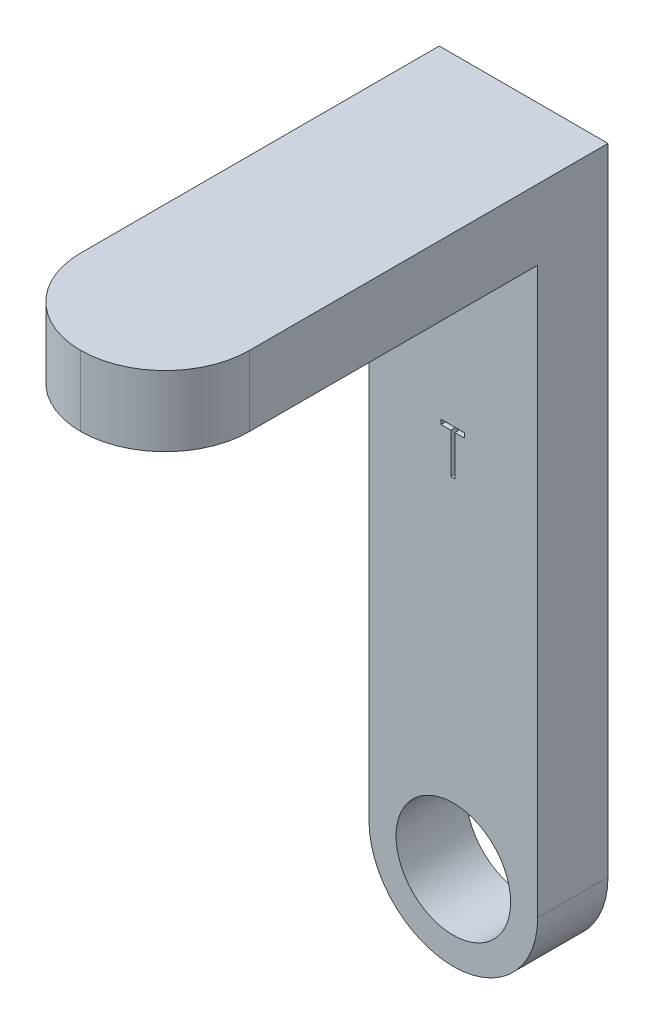
ISO-10303-21;
HEADER;
FILE_DESCRIPTION(('STEP AP214'),'2;1');
FILE_NAME('part.step','',(''),(''),'','','');
FILE_SCHEMA(('AUTOMOTIVE_DESIGN { 1 0 10303 214 1 1 1 1 }'));
ENDSEC;
DATA;
#1=APPLICATION_CONTEXT('core data for automotive mechanical design processes');
#2=APPLICATION_PROTOCOL_DEFINITION('international standard','automotive_design',2000,#1);
#3=PRODUCT_CONTEXT('',#1,'mechanical');
#4=PRODUCT('Part','Part','',(#3));
#5=PRODUCT_RELATED_PRODUCT_CATEGORY('part','',(#4));
#6=PRODUCT_DEFINITION_FORMATION('','',#4);
#7=PRODUCT_DEFINITION_CONTEXT('part definition',#1,'design');
#8=PRODUCT_DEFINITION('design','',#6,#7);
#9=PRODUCT_DEFINITION_SHAPE('','',#8);
#10=(LENGTH_UNIT() NAMED_UNIT(*) SI_UNIT(.MILLI.,.METRE.));
#11=(NAMED_UNIT(*) PLANE_ANGLE_UNIT() SI_UNIT($,.RADIAN.));
#12=(NAMED_UNIT(*) SI_UNIT($,.STERADIAN.) SOLID_ANGLE_UNIT());
#13=UNCERTAINTY_MEASURE_WITH_UNIT(LENGTH_MEASURE(1.E-05),#10,'distance_accuracy_value','');
#14=(GEOMETRIC_REPRESENTATION_CONTEXT(3) GLOBAL_UNCERTAINTY_ASSIGNED_CONTEXT((#13)) GLOBAL_UNIT_ASSIGNED_CONTEXT((#10,
#11,#12)) REPRESENTATION_CONTEXT('',''));
#15=CARTESIAN_POINT('',(0.,0.,0.));
#16=DIRECTION('',(0.,0.,1.));
#17=DIRECTION('',(1.,0.,0.));
#18=AXIS2_PLACEMENT_3D('',#15,#16,#17);
#19=CARTESIAN_POINT('',(0.,0.,5.));
#20=DIRECTION('',(0.,0.,1.));
#21=DIRECTION('',(1.,0.,0.));
#22=AXIS2_PLACEMENT_3D('',#19,#20,#21);
#23=PLANE('',#22);
#24=DIRECTION('',(1.,0.,0.));
#25=VECTOR('',#24,1.);
#26=CARTESIAN_POINT('',(-6.,40.2,5.));
#27=LINE('',#26,#25);
#28=CARTESIAN_POINT('',(-6.,40.2,5.));
#29=VERTEX_POINT('',#28);
#30=CARTESIAN_POINT('',(6.,40.2,5.));
#31=VERTEX_POINT('',#30);
#32=EDGE_CURVE('E188',#29,#31,#27,.T.);
#33=ORIENTED_EDGE('',*,*,#32,.F.);
#34=DIRECTION('',(0.,-1.,0.));
#35=VECTOR('',#34,1.);
#36=CARTESIAN_POINT('',(-6.,0.,5.));
#37=LINE('',#36,#35);
#38=CARTESIAN_POINT('',(-6.,0.,5.));
#39=VERTEX_POINT('',#38);
#40=EDGE_CURVE('E211',#29,#39,#37,.T.);
#41=ORIENTED_EDGE('',*,*,#40,.T.);
#42=CARTESIAN_POINT('',(0.,0.,5.));
#43=DIRECTION('',(0.,0.,1.));
#44=DIRECTION('',(1.,0.,0.));
#45=AXIS2_PLACEMENT_3D('',#42,#43,#44);
#46=CIRCLE('',#45,6.);
#47=CARTESIAN_POINT('',(6.,0.,5.));
#48=VERTEX_POINT('',#47);
#49=EDGE_CURVE('E257',#39,#48,#46,.T.);
#50=ORIENTED_EDGE('',*,*,#49,.T.);
#51=DIRECTION('',(0.,1.,0.));
#52=VECTOR('',#51,1.);
#53=CARTESIAN_POINT('',(6.,0.,5.));
#54=LINE('',#53,#52);
#55=EDGE_CURVE('E205',#48,#31,#54,.T.);
#56=ORIENTED_EDGE('',*,*,#55,.T.);
#57=EDGE_LOOP('',(#33,#41,#50,#56));
#58=FACE_BOUND('',#57,.T.);
#59=CARTESIAN_POINT('',(0.,0.,5.));
#60=DIRECTION('',(0.,0.,1.));
#61=DIRECTION('',(1.,0.,0.));
#62=AXIS2_PLACEMENT_3D('',#59,#60,#61);
#63=CIRCLE('',#62,4.075);
#64=CARTESIAN_POINT('',(4.075,0.,5.));
#65=VERTEX_POINT('',#64);
#66=EDGE_CURVE('E239',#65,#65,#63,.T.);
#67=ORIENTED_EDGE('',*,*,#66,.F.);
#68=EDGE_LOOP('',(#67));
#69=FACE_BOUND('',#68,.T.);
#70=DIRECTION('',(0.,1.,0.));
#71=VECTOR('',#70,1.);
#72=CARTESIAN_POINT('',(-0.180940787218244,24.0946969776369,5.));
#73=LINE('',#72,#71);
#74=CARTESIAN_POINT('',(-0.180940787218244,24.0946969776369,5.));
#75=VERTEX_POINT('',#74);
#76=CARTESIAN_POINT('',(-0.180940787218244,26.9440559519959,5.));
#77=VERTEX_POINT('',#76);
#78=EDGE_CURVE('E177',#75,#77,#73,.T.);
#79=ORIENTED_EDGE('',*,*,#78,.T.);
#80=DIRECTION('',(-1.,0.,0.));
#81=VECTOR('',#80,1.);
#82=CARTESIAN_POINT('',(-0.180940787218244,26.9440559519959,5.));
#83=LINE('',#82,#81);
#84=CARTESIAN_POINT('',(-0.872927966705424,26.9440559519959,5.));
#85=VERTEX_POINT('',#84);
#86=EDGE_CURVE('E56',#77,#85,#83,.T.);
#87=ORIENTED_EDGE('',*,*,#86,.T.);
#88=DIRECTION('',(0.,1.,0.));
#89=VECTOR('',#88,1.);
#90=CARTESIAN_POINT('',(-0.872927966705424,26.9440559519959,5.));
#91=LINE('',#90,#89);
#92=CARTESIAN_POINT('',(-0.872927966705424,27.2696969776369,5.));
#93=VERTEX_POINT('',#92);
#94=EDGE_CURVE('E181',#85,#93,#91,.T.);
#95=ORIENTED_EDGE('',*,*,#94,.T.);
#96=DIRECTION('',(1.,0.,0.));
#97=VECTOR('',#96,1.);
#98=CARTESIAN_POINT('',(-0.872927966705424,27.2696969776369,5.));
#99=LINE('',#98,#97);
#100=CARTESIAN_POINT('',(0.795982289704833,27.2696969776369,5.));
#101=VERTEX_POINT('',#100);
#102=EDGE_CURVE('E555',#93,#101,#99,.T.);
#103=ORIENTED_EDGE('',*,*,#102,.T.);
#104=DIRECTION('',(0.,-1.,0.));
#105=VECTOR('',#104,1.);
#106=CARTESIAN_POINT('',(0.795982289704833,27.2696969776369,5.));
#107=LINE('',#106,#105);
#108=CARTESIAN_POINT('',(0.795982289704833,26.9440559519959,5.));
#109=VERTEX_POINT('',#108);
#110=EDGE_CURVE('E557',#101,#109,#107,.T.);
#111=ORIENTED_EDGE('',*,*,#110,.T.);
#112=DIRECTION('',(-1.,0.,0.));
#113=VECTOR('',#112,1.);
#114=CARTESIAN_POINT('',(0.795982289704833,26.9440559519959,5.));
#115=LINE('',#114,#113);
#116=CARTESIAN_POINT('',(0.103995110217653,26.9440559519959,5.));
#117=VERTEX_POINT('',#116);
#118=EDGE_CURVE('E533',#109,#117,#115,.T.);
#119=ORIENTED_EDGE('',*,*,#118,.T.);
#120=DIRECTION('',(0.,-1.,0.));
#121=VECTOR('',#120,1.);
#122=CARTESIAN_POINT('',(0.103995110217653,26.9440559519959,5.));
#123=LINE('',#122,#121);
#124=CARTESIAN_POINT('',(0.103995110217653,24.0946969776369,5.));
#125=VERTEX_POINT('',#124);
#126=EDGE_CURVE('E528',#117,#125,#123,.T.);
#127=ORIENTED_EDGE('',*,*,#126,.T.);
#128=DIRECTION('',(-1.,0.,0.));
#129=VECTOR('',#128,1.);
#130=CARTESIAN_POINT('',(0.103995110217653,24.0946969776369,5.));
#131=LINE('',#130,#129);
#132=EDGE_CURVE('E522',#125,#75,#131,.T.);
#133=ORIENTED_EDGE('',*,*,#132,.T.);
#134=EDGE_LOOP('',(#79,#87,#95,#103,#111,#119,#127,#133));
#135=FACE_BOUND('',#134,.T.);
#136=ADVANCED_FACE('F39',(#58,#69,#135),#23,.T.);
#137=CARTESIAN_POINT('',(-2.83725219182222,2.925,5.));
#138=DIRECTION('',(0.,-1.,0.));
#139=DIRECTION('',(0.,0.,-1.));
#140=AXIS2_PLACEMENT_3D('',#137,#138,#139);
#141=PLANE('',#140);
#142=DIRECTION('',(0.,0.,-1.));
#143=VECTOR('',#142,1.);
#144=CARTESIAN_POINT('',(2.83725219182222,2.925,5.));
#145=LINE('',#144,#143);
#146=CARTESIAN_POINT('',(2.83725219182222,2.925,2.));
#147=VERTEX_POINT('',#146);
#148=CARTESIAN_POINT('',(2.83725219182222,2.925,0.));
#149=VERTEX_POINT('',#148);
#150=EDGE_CURVE('E253',#147,#149,#145,.T.);
#151=ORIENTED_EDGE('',*,*,#150,.F.);
#152=DIRECTION('',(-1.,0.,0.));
#153=VECTOR('',#152,1.);
#154=CARTESIAN_POINT('',(-2.83725219182222,2.925,2.));
#155=LINE('',#154,#153);
#156=CARTESIAN_POINT('',(-2.83725219182222,2.925,2.));
#157=VERTEX_POINT('',#156);
#158=EDGE_CURVE('E261',#147,#157,#155,.T.);
#159=ORIENTED_EDGE('',*,*,#158,.T.);
#160=DIRECTION('',(0.,0.,-1.));
#161=VECTOR('',#160,1.);
#162=CARTESIAN_POINT('',(-2.83725219182222,2.925,5.));
#163=LINE('',#162,#161);
#164=CARTESIAN_POINT('',(-2.83725219182222,2.925,0.));
#165=VERTEX_POINT('',#164);
#166=EDGE_CURVE('E243',#157,#165,#163,.T.);
#167=ORIENTED_EDGE('',*,*,#166,.T.);
#168=DIRECTION('',(-1.,0.,0.));
#169=VECTOR('',#168,1.);
#170=CARTESIAN_POINT('',(-2.83725219182222,2.925,0.));
#171=LINE('',#170,#169);
#172=EDGE_CURVE('E244',#149,#165,#171,.T.);
#173=ORIENTED_EDGE('',*,*,#172,.F.);
#174=EDGE_LOOP('',(#151,#159,#167,#173));
#175=FACE_BOUND('',#174,.T.);
#176=ADVANCED_FACE('F322',(#175),#141,.T.);
#177=CARTESIAN_POINT('',(0.,0.,0.));
#178=DIRECTION('',(0.,0.,1.));
#179=DIRECTION('',(1.,0.,0.));
#180=AXIS2_PLACEMENT_3D('',#177,#178,#179);
#181=PLANE('',#180);
#182=CARTESIAN_POINT('',(0.,0.,0.));
#183=DIRECTION('',(0.,0.,1.));
#184=DIRECTION('',(1.,0.,0.));
#185=AXIS2_PLACEMENT_3D('',#182,#183,#184);
#186=CIRCLE('',#185,6.);
#187=CARTESIAN_POINT('',(-6.,0.,0.));
#188=VERTEX_POINT('',#187);
#189=CARTESIAN_POINT('',(6.,0.,0.));
#190=VERTEX_POINT('',#189);
#191=EDGE_CURVE('E256',#188,#190,#186,.T.);
#192=ORIENTED_EDGE('',*,*,#191,.F.);
#193=DIRECTION('',(0.,-1.,0.));
#194=VECTOR('',#193,1.);
#195=CARTESIAN_POINT('',(-6.,0.,0.));
#196=LINE('',#195,#194);
#197=CARTESIAN_POINT('',(-6.,45.2,0.));
#198=VERTEX_POINT('',#197);
#199=EDGE_CURVE('E215',#198,#188,#196,.T.);
#200=ORIENTED_EDGE('',*,*,#199,.F.);
#201=DIRECTION('',(-1.,0.,0.));
#202=VECTOR('',#201,1.);
#203=CARTESIAN_POINT('',(6.,45.2,0.));
#204=LINE('',#203,#202);
#205=CARTESIAN_POINT('',(6.,45.2,0.));
#206=VERTEX_POINT('',#205);
#207=EDGE_CURVE('E210',#206,#198,#204,.T.);
#208=ORIENTED_EDGE('',*,*,#207,.F.);
#209=DIRECTION('',(0.,1.,0.));
#210=VECTOR('',#209,1.);
#211=CARTESIAN_POINT('',(6.,0.,0.));
#212=LINE('',#211,#210);
#213=EDGE_CURVE('E206',#190,#206,#212,.T.);
#214=ORIENTED_EDGE('',*,*,#213,.F.);
#215=EDGE_LOOP('',(#192,#200,#208,#214));
#216=FACE_BOUND('',#215,.T.);
#217=CARTESIAN_POINT('',(0.,0.,0.));
#218=DIRECTION('',(0.,0.,1.));
#219=DIRECTION('',(1.,0.,0.));
#220=AXIS2_PLACEMENT_3D('',#217,#218,#219);
#221=CIRCLE('',#220,4.075);
#222=EDGE_CURVE('E228',#165,#149,#221,.T.);
#223=ORIENTED_EDGE('',*,*,#222,.T.);
#224=ORIENTED_EDGE('',*,*,#172,.T.);
#225=EDGE_LOOP('',(#223,#224));
#226=FACE_BOUND('',#225,.T.);
#227=ADVANCED_FACE('F309',(#216,#226),#181,.F.);
#228=CARTESIAN_POINT('',(0.,0.,5.));
#229=DIRECTION('',(0.,0.,-1.));
#230=DIRECTION('',(-1.,0.,0.));
#231=AXIS2_PLACEMENT_3D('',#228,#229,#230);
#232=CYLINDRICAL_SURFACE('',#231,6.);
#233=ORIENTED_EDGE('',*,*,#49,.F.);
#234=DIRECTION('',(0.,0.,1.));
#235=VECTOR('',#234,1.);
#236=CARTESIAN_POINT('',(-6.,0.,0.));
#237=LINE('',#236,#235);
#238=EDGE_CURVE('E224',#188,#39,#237,.T.);
#239=ORIENTED_EDGE('',*,*,#238,.F.);
#240=ORIENTED_EDGE('',*,*,#191,.T.);
#241=DIRECTION('',(0.,0.,1.));
#242=VECTOR('',#241,1.);
#243=CARTESIAN_POINT('',(6.,0.,0.));
#244=LINE('',#243,#242);
#245=EDGE_CURVE('E218',#190,#48,#244,.T.);
#246=ORIENTED_EDGE('',*,*,#245,.T.);
#247=EDGE_LOOP('',(#233,#239,#240,#246));
#248=FACE_BOUND('',#247,.T.);
#249=ADVANCED_FACE('F312',(#248),#232,.T.);
#250=CARTESIAN_POINT('',(0.,0.,5.));
#251=DIRECTION('',(0.,0.,-1.));
#252=DIRECTION('',(-1.,0.,0.));
#253=AXIS2_PLACEMENT_3D('',#250,#251,#252);
#254=CYLINDRICAL_SURFACE('',#253,4.075);
#255=CARTESIAN_POINT('',(0.,0.,2.));
#256=DIRECTION('',(0.,0.,1.));
#257=DIRECTION('',(1.,0.,0.));
#258=AXIS2_PLACEMENT_3D('',#255,#256,#257);
#259=CIRCLE('',#258,4.075);
#260=EDGE_CURVE('E202',#147,#157,#259,.T.);
#261=ORIENTED_EDGE('',*,*,#260,.F.);
#262=ORIENTED_EDGE('',*,*,#150,.T.);
#263=ORIENTED_EDGE('',*,*,#222,.F.);
#264=ORIENTED_EDGE('',*,*,#166,.F.);
#265=EDGE_LOOP('',(#261,#262,#263,#264));
#266=FACE_BOUND('',#265,.T.);
#267=ORIENTED_EDGE('',*,*,#66,.T.);
#268=EDGE_LOOP('',(#267));
#269=FACE_BOUND('',#268,.T.);
#270=ADVANCED_FACE('F314',(#266,#269),#254,.F.);
#271=CARTESIAN_POINT('',(-6.,0.,0.));
#272=DIRECTION('',(-1.,0.,0.));
#273=DIRECTION('',(0.,0.,1.));
#274=AXIS2_PLACEMENT_3D('',#271,#272,#273);
#275=PLANE('',#274);
#276=DIRECTION('',(0.,0.,-1.));
#277=VECTOR('',#276,1.);
#278=CARTESIAN_POINT('',(-6.,40.2,31.5));
#279=LINE('',#278,#277);
#280=CARTESIAN_POINT('',(-6.,40.2,25.5));
#281=VERTEX_POINT('',#280);
#282=EDGE_CURVE('E199',#281,#29,#279,.T.);
#283=ORIENTED_EDGE('',*,*,#282,.F.);
#284=DIRECTION('',(0.,-1.,0.));
#285=VECTOR('',#284,1.);
#286=CARTESIAN_POINT('',(-6.,0.,25.5));
#287=LINE('',#286,#285);
#288=CARTESIAN_POINT('',(-6.,45.2,25.5));
#289=VERTEX_POINT('',#288);
#290=EDGE_CURVE('E274',#281,#289,#287,.F.);
#291=ORIENTED_EDGE('',*,*,#290,.T.);
#292=DIRECTION('',(0.,0.,1.));
#293=VECTOR('',#292,1.);
#294=CARTESIAN_POINT('',(-6.,45.2,0.));
#295=LINE('',#294,#293);
#296=EDGE_CURVE('E229',#198,#289,#295,.T.);
#297=ORIENTED_EDGE('',*,*,#296,.F.);
#298=ORIENTED_EDGE('',*,*,#199,.T.);
#299=ORIENTED_EDGE('',*,*,#238,.T.);
#300=ORIENTED_EDGE('',*,*,#40,.F.);
#301=EDGE_LOOP('',(#283,#291,#297,#298,#299,#300));
#302=FACE_BOUND('',#301,.T.);
#303=ADVANCED_FACE('F297',(#302),#275,.T.);
#304=CARTESIAN_POINT('',(6.,45.2,0.));
#305=DIRECTION('',(0.,1.,0.));
#306=DIRECTION('',(0.,0.,1.));
#307=AXIS2_PLACEMENT_3D('',#304,#305,#306);
#308=PLANE('',#307);
#309=ORIENTED_EDGE('',*,*,#296,.T.);
#310=CARTESIAN_POINT('',(0.,45.2,25.5));
#311=DIRECTION('',(0.,1.,0.));
#312=DIRECTION('',(0.,0.,1.));
#313=AXIS2_PLACEMENT_3D('',#310,#311,#312);
#314=CIRCLE('',#313,6.);
#315=CARTESIAN_POINT('',(0.,45.2,31.5));
#316=VERTEX_POINT('',#315);
#317=EDGE_CURVE('E49',#289,#316,#314,.T.);
#318=ORIENTED_EDGE('',*,*,#317,.T.);
#319=CARTESIAN_POINT('',(0.,45.2,25.5));
#320=DIRECTION('',(0.,1.,0.));
#321=DIRECTION('',(0.,0.,1.));
#322=AXIS2_PLACEMENT_3D('',#319,#320,#321);
#323=CIRCLE('',#322,6.);
#324=CARTESIAN_POINT('',(6.,45.2,25.5));
#325=VERTEX_POINT('',#324);
#326=EDGE_CURVE('E64',#316,#325,#323,.T.);
#327=ORIENTED_EDGE('',*,*,#326,.T.);
#328=DIRECTION('',(0.,0.,1.));
#329=VECTOR('',#328,1.);
#330=CARTESIAN_POINT('',(6.,45.2,0.));
#331=LINE('',#330,#329);
#332=EDGE_CURVE('E233',#206,#325,#331,.T.);
#333=ORIENTED_EDGE('',*,*,#332,.F.);
#334=ORIENTED_EDGE('',*,*,#207,.T.);
#335=EDGE_LOOP('',(#309,#318,#327,#333,#334));
#336=FACE_BOUND('',#335,.T.);
#337=ADVANCED_FACE('F281',(#336),#308,.T.);
#338=CARTESIAN_POINT('',(6.,0.,0.));
#339=DIRECTION('',(1.,0.,0.));
#340=DIRECTION('',(0.,0.,-1.));
#341=AXIS2_PLACEMENT_3D('',#338,#339,#340);
#342=PLANE('',#341);
#343=ORIENTED_EDGE('',*,*,#332,.T.);
#344=DIRECTION('',(0.,1.,0.));
#345=VECTOR('',#344,1.);
#346=CARTESIAN_POINT('',(6.,0.,25.5));
#347=LINE('',#346,#345);
#348=CARTESIAN_POINT('',(6.,40.2,25.5));
#349=VERTEX_POINT('',#348);
#350=EDGE_CURVE('E11',#325,#349,#347,.F.);
#351=ORIENTED_EDGE('',*,*,#350,.T.);
#352=DIRECTION('',(0.,0.,-1.));
#353=VECTOR('',#352,1.);
#354=CARTESIAN_POINT('',(6.,40.2,31.5));
#355=LINE('',#354,#353);
#356=EDGE_CURVE('E196',#349,#31,#355,.T.);
#357=ORIENTED_EDGE('',*,*,#356,.T.);
#358=ORIENTED_EDGE('',*,*,#55,.F.);
#359=ORIENTED_EDGE('',*,*,#245,.F.);
#360=ORIENTED_EDGE('',*,*,#213,.T.);
#361=EDGE_LOOP('',(#343,#351,#357,#358,#359,#360));
#362=FACE_BOUND('',#361,.T.);
#363=ADVANCED_FACE('F303',(#362),#342,.T.);
#364=CARTESIAN_POINT('',(0.,0.,2.));
#365=DIRECTION('',(0.,0.,1.));
#366=DIRECTION('',(1.,0.,0.));
#367=AXIS2_PLACEMENT_3D('',#364,#365,#366);
#368=PLANE('',#367);
#369=ORIENTED_EDGE('',*,*,#260,.T.);
#370=ORIENTED_EDGE('',*,*,#158,.F.);
#371=EDGE_LOOP('',(#369,#370));
#372=FACE_BOUND('',#371,.T.);
#373=ADVANCED_FACE('F334',(#372),#368,.T.);
#374=CARTESIAN_POINT('',(-6.,40.2,31.5));
#375=DIRECTION('',(0.,1.,0.));
#376=DIRECTION('',(0.,0.,1.));
#377=AXIS2_PLACEMENT_3D('',#374,#375,#376);
#378=PLANE('',#377);
#379=CARTESIAN_POINT('',(0.,40.2,25.5));
#380=DIRECTION('',(0.,1.,0.));
#381=DIRECTION('',(0.,0.,1.));
#382=AXIS2_PLACEMENT_3D('',#379,#380,#381);
#383=CIRCLE('',#382,6.);
#384=CARTESIAN_POINT('',(0.,40.2,31.5));
#385=VERTEX_POINT('',#384);
#386=EDGE_CURVE('E268',#349,#385,#383,.F.);
#387=ORIENTED_EDGE('',*,*,#386,.T.);
#388=CARTESIAN_POINT('',(0.,40.2,25.5));
#389=DIRECTION('',(0.,1.,0.));
#390=DIRECTION('',(0.,0.,1.));
#391=AXIS2_PLACEMENT_3D('',#388,#389,#390);
#392=CIRCLE('',#391,6.);
#393=EDGE_CURVE('E271',#385,#281,#392,.F.);
#394=ORIENTED_EDGE('',*,*,#393,.T.);
#395=ORIENTED_EDGE('',*,*,#282,.T.);
#396=ORIENTED_EDGE('',*,*,#32,.T.);
#397=ORIENTED_EDGE('',*,*,#356,.F.);
#398=EDGE_LOOP('',(#387,#394,#395,#396,#397));
#399=FACE_BOUND('',#398,.T.);
#400=ADVANCED_FACE('F292',(#399),#378,.F.);
#401=CARTESIAN_POINT('',(0.,0.,25.5));
#402=DIRECTION('',(0.,1.,0.));
#403=DIRECTION('',(0.,0.,1.));
#404=AXIS2_PLACEMENT_3D('',#401,#402,#403);
#405=CYLINDRICAL_SURFACE('',#404,6.);
#406=ORIENTED_EDGE('',*,*,#350,.F.);
#407=ORIENTED_EDGE('',*,*,#326,.F.);
#408=DIRECTION('',(0.,1.,0.));
#409=VECTOR('',#408,1.);
#410=CARTESIAN_POINT('',(0.,0.,31.5));
#411=LINE('',#410,#409);
#412=EDGE_CURVE('E43',#385,#316,#411,.T.);
#413=ORIENTED_EDGE('',*,*,#412,.F.);
#414=ORIENTED_EDGE('',*,*,#386,.F.);
#415=EDGE_LOOP('',(#406,#407,#413,#414));
#416=FACE_BOUND('',#415,.T.);
#417=ADVANCED_FACE('F41',(#416),#405,.T.);
#418=CARTESIAN_POINT('',(0.,0.,25.5));
#419=DIRECTION('',(0.,-1.,0.));
#420=DIRECTION('',(0.,0.,-1.));
#421=AXIS2_PLACEMENT_3D('',#418,#419,#420);
#422=CYLINDRICAL_SURFACE('',#421,6.);
#423=ORIENTED_EDGE('',*,*,#317,.F.);
#424=ORIENTED_EDGE('',*,*,#290,.F.);
#425=ORIENTED_EDGE('',*,*,#393,.F.);
#426=ORIENTED_EDGE('',*,*,#412,.T.);
#427=EDGE_LOOP('',(#423,#424,#425,#426));
#428=FACE_BOUND('',#427,.T.);
#429=ADVANCED_FACE('F289',(#428),#422,.T.);
#430=CARTESIAN_POINT('',(-0.180940787218244,26.9440559519959,4.5));
#431=DIRECTION('',(0.,1.,0.));
#432=DIRECTION('',(0.,0.,1.));
#433=AXIS2_PLACEMENT_3D('',#430,#431,#432);
#434=PLANE('',#433);
#435=ORIENTED_EDGE('',*,*,#86,.F.);
#436=DIRECTION('',(0.,0.,1.));
#437=VECTOR('',#436,1.);
#438=CARTESIAN_POINT('',(-0.180940787218244,26.9440559519959,4.5));
#439=LINE('',#438,#437);
#440=CARTESIAN_POINT('',(-0.180940787218244,26.9440559519959,4.5));
#441=VERTEX_POINT('',#440);
#442=EDGE_CURVE('E175',#441,#77,#439,.T.);
#443=ORIENTED_EDGE('',*,*,#442,.F.);
#444=DIRECTION('',(-1.,0.,0.));
#445=VECTOR('',#444,1.);
#446=CARTESIAN_POINT('',(-0.180940787218244,26.9440559519959,4.5));
#447=LINE('',#446,#445);
#448=CARTESIAN_POINT('',(-0.872927966705424,26.9440559519959,4.5));
#449=VERTEX_POINT('',#448);
#450=EDGE_CURVE('E165',#441,#449,#447,.T.);
#451=ORIENTED_EDGE('',*,*,#450,.T.);
#452=DIRECTION('',(0.,0.,1.));
#453=VECTOR('',#452,1.);
#454=CARTESIAN_POINT('',(-0.872927966705424,26.9440559519959,4.5));
#455=LINE('',#454,#453);
#456=EDGE_CURVE('E174',#449,#85,#455,.T.);
#457=ORIENTED_EDGE('',*,*,#456,.T.);
#458=EDGE_LOOP('',(#435,#443,#451,#457));
#459=FACE_BOUND('',#458,.T.);
#460=ADVANCED_FACE('F173',(#459),#434,.T.);
#461=CARTESIAN_POINT('',(-0.872927966705424,26.9440559519959,4.5));
#462=DIRECTION('',(1.,0.,0.));
#463=DIRECTION('',(0.,0.,-1.));
#464=AXIS2_PLACEMENT_3D('',#461,#462,#463);
#465=PLANE('',#464);
#466=ORIENTED_EDGE('',*,*,#94,.F.);
#467=ORIENTED_EDGE('',*,*,#456,.F.);
#468=DIRECTION('',(0.,1.,0.));
#469=VECTOR('',#468,1.);
#470=CARTESIAN_POINT('',(-0.872927966705424,26.9440559519959,4.5));
#471=LINE('',#470,#469);
#472=CARTESIAN_POINT('',(-0.872927966705424,27.2696969776369,4.5));
#473=VERTEX_POINT('',#472);
#474=EDGE_CURVE('E161',#449,#473,#471,.T.);
#475=ORIENTED_EDGE('',*,*,#474,.T.);
#476=DIRECTION('',(0.,0.,1.));
#477=VECTOR('',#476,1.);
#478=CARTESIAN_POINT('',(-0.872927966705424,27.2696969776369,4.5));
#479=LINE('',#478,#477);
#480=EDGE_CURVE('E183',#473,#93,#479,.T.);
#481=ORIENTED_EDGE('',*,*,#480,.T.);
#482=EDGE_LOOP('',(#466,#467,#475,#481));
#483=FACE_BOUND('',#482,.T.);
#484=ADVANCED_FACE('F179',(#483),#465,.T.);
#485=CARTESIAN_POINT('',(-0.872927966705424,27.2696969776369,4.5));
#486=DIRECTION('',(0.,-1.,0.));
#487=DIRECTION('',(0.,0.,-1.));
#488=AXIS2_PLACEMENT_3D('',#485,#486,#487);
#489=PLANE('',#488);
#490=ORIENTED_EDGE('',*,*,#102,.F.);
#491=ORIENTED_EDGE('',*,*,#480,.F.);
#492=DIRECTION('',(1.,0.,0.));
#493=VECTOR('',#492,1.);
#494=CARTESIAN_POINT('',(-0.872927966705424,27.2696969776369,4.5));
#495=LINE('',#494,#493);
#496=CARTESIAN_POINT('',(0.795982289704833,27.2696969776369,4.5));
#497=VERTEX_POINT('',#496);
#498=EDGE_CURVE('E167',#473,#497,#495,.T.);
#499=ORIENTED_EDGE('',*,*,#498,.T.);
#500=DIRECTION('',(0.,0.,1.));
#501=VECTOR('',#500,1.);
#502=CARTESIAN_POINT('',(0.795982289704833,27.2696969776369,4.5));
#503=LINE('',#502,#501);
#504=EDGE_CURVE('E189',#497,#101,#503,.T.);
#505=ORIENTED_EDGE('',*,*,#504,.T.);
#506=EDGE_LOOP('',(#490,#491,#499,#505));
#507=FACE_BOUND('',#506,.T.);
#508=ADVANCED_FACE('F348',(#507),#489,.T.);
#509=CARTESIAN_POINT('',(0.795982289704833,27.2696969776369,4.5));
#510=DIRECTION('',(-1.,0.,0.));
#511=DIRECTION('',(0.,0.,1.));
#512=AXIS2_PLACEMENT_3D('',#509,#510,#511);
#513=PLANE('',#512);
#514=ORIENTED_EDGE('',*,*,#110,.F.);
#515=ORIENTED_EDGE('',*,*,#504,.F.);
#516=DIRECTION('',(0.,-1.,0.));
#517=VECTOR('',#516,1.);
#518=CARTESIAN_POINT('',(0.795982289704833,27.2696969776369,4.5));
#519=LINE('',#518,#517);
#520=CARTESIAN_POINT('',(0.795982289704833,26.9440559519959,4.5));
#521=VERTEX_POINT('',#520);
#522=EDGE_CURVE('E585',#497,#521,#519,.T.);
#523=ORIENTED_EDGE('',*,*,#522,.T.);
#524=DIRECTION('',(0.,0.,1.));
#525=VECTOR('',#524,1.);
#526=CARTESIAN_POINT('',(0.795982289704833,26.9440559519959,4.5));
#527=LINE('',#526,#525);
#528=EDGE_CURVE('E548',#521,#109,#527,.T.);
#529=ORIENTED_EDGE('',*,*,#528,.T.);
#530=EDGE_LOOP('',(#514,#515,#523,#529));
#531=FACE_BOUND('',#530,.T.);
#532=ADVANCED_FACE('F351',(#531),#513,.T.);
#533=CARTESIAN_POINT('',(0.795982289704833,26.9440559519959,4.5));
#534=DIRECTION('',(0.,1.,0.));
#535=DIRECTION('',(0.,0.,1.));
#536=AXIS2_PLACEMENT_3D('',#533,#534,#535);
#537=PLANE('',#536);
#538=ORIENTED_EDGE('',*,*,#118,.F.);
#539=ORIENTED_EDGE('',*,*,#528,.F.);
#540=DIRECTION('',(-1.,0.,0.));
#541=VECTOR('',#540,1.);
#542=CARTESIAN_POINT('',(0.795982289704833,26.9440559519959,4.5));
#543=LINE('',#542,#541);
#544=CARTESIAN_POINT('',(0.103995110217653,26.9440559519959,4.5));
#545=VERTEX_POINT('',#544);
#546=EDGE_CURVE('E570',#521,#545,#543,.T.);
#547=ORIENTED_EDGE('',*,*,#546,.T.);
#548=DIRECTION('',(0.,0.,1.));
#549=VECTOR('',#548,1.);
#550=CARTESIAN_POINT('',(0.103995110217653,26.9440559519959,4.5));
#551=LINE('',#550,#549);
#552=EDGE_CURVE('E545',#545,#117,#551,.T.);
#553=ORIENTED_EDGE('',*,*,#552,.T.);
#554=EDGE_LOOP('',(#538,#539,#547,#553));
#555=FACE_BOUND('',#554,.T.);
#556=ADVANCED_FACE('F355',(#555),#537,.T.);
#557=CARTESIAN_POINT('',(0.103995110217653,26.9440559519959,4.5));
#558=DIRECTION('',(-1.,0.,0.));
#559=DIRECTION('',(0.,0.,1.));
#560=AXIS2_PLACEMENT_3D('',#557,#558,#559);
#561=PLANE('',#560);
#562=ORIENTED_EDGE('',*,*,#126,.F.);
#563=ORIENTED_EDGE('',*,*,#552,.F.);
#564=DIRECTION('',(0.,-1.,0.));
#565=VECTOR('',#564,1.);
#566=CARTESIAN_POINT('',(0.103995110217653,26.9440559519959,4.5));
#567=LINE('',#566,#565);
#568=CARTESIAN_POINT('',(0.103995110217653,24.0946969776369,4.5));
#569=VERTEX_POINT('',#568);
#570=EDGE_CURVE('E572',#545,#569,#567,.T.);
#571=ORIENTED_EDGE('',*,*,#570,.T.);
#572=DIRECTION('',(0.,0.,1.));
#573=VECTOR('',#572,1.);
#574=CARTESIAN_POINT('',(0.103995110217653,24.0946969776369,4.5));
#575=LINE('',#574,#573);
#576=EDGE_CURVE('E542',#569,#125,#575,.T.);
#577=ORIENTED_EDGE('',*,*,#576,.T.);
#578=EDGE_LOOP('',(#562,#563,#571,#577));
#579=FACE_BOUND('',#578,.T.);
#580=ADVANCED_FACE('F359',(#579),#561,.T.);
#581=CARTESIAN_POINT('',(0.103995110217653,24.0946969776369,4.5));
#582=DIRECTION('',(0.,1.,0.));
#583=DIRECTION('',(0.,0.,1.));
#584=AXIS2_PLACEMENT_3D('',#581,#582,#583);
#585=PLANE('',#584);
#586=ORIENTED_EDGE('',*,*,#132,.F.);
#587=ORIENTED_EDGE('',*,*,#576,.F.);
#588=DIRECTION('',(-1.,0.,0.));
#589=VECTOR('',#588,1.);
#590=CARTESIAN_POINT('',(0.103995110217653,24.0946969776369,4.5));
#591=LINE('',#590,#589);
#592=CARTESIAN_POINT('',(-0.180940787218244,24.0946969776369,4.5));
#593=VERTEX_POINT('',#592);
#594=EDGE_CURVE('E574',#569,#593,#591,.T.);
#595=ORIENTED_EDGE('',*,*,#594,.T.);
#596=DIRECTION('',(0.,0.,1.));
#597=VECTOR('',#596,1.);
#598=CARTESIAN_POINT('',(-0.180940787218244,24.0946969776369,4.5));
#599=LINE('',#598,#597);
#600=EDGE_CURVE('E519',#593,#75,#599,.T.);
#601=ORIENTED_EDGE('',*,*,#600,.T.);
#602=EDGE_LOOP('',(#586,#587,#595,#601));
#603=FACE_BOUND('',#602,.T.);
#604=ADVANCED_FACE('F363',(#603),#585,.T.);
#605=CARTESIAN_POINT('',(-0.180940787218244,24.0946969776369,4.5));
#606=DIRECTION('',(1.,0.,0.));
#607=DIRECTION('',(0.,0.,-1.));
#608=AXIS2_PLACEMENT_3D('',#605,#606,#607);
#609=PLANE('',#608);
#610=ORIENTED_EDGE('',*,*,#78,.F.);
#611=ORIENTED_EDGE('',*,*,#600,.F.);
#612=DIRECTION('',(0.,1.,0.));
#613=VECTOR('',#612,1.);
#614=CARTESIAN_POINT('',(-0.180940787218244,24.0946969776369,4.5));
#615=LINE('',#614,#613);
#616=EDGE_CURVE('E539',#593,#441,#615,.T.);
#617=ORIENTED_EDGE('',*,*,#616,.T.);
#618=ORIENTED_EDGE('',*,*,#442,.T.);
#619=EDGE_LOOP('',(#610,#611,#617,#618));
#620=FACE_BOUND('',#619,.T.);
#621=ADVANCED_FACE('F367',(#620),#609,.T.);
#622=CARTESIAN_POINT('',(0.,0.,4.5));
#623=DIRECTION('',(0.,0.,-1.));
#624=DIRECTION('',(-1.,0.,0.));
#625=AXIS2_PLACEMENT_3D('',#622,#623,#624);
#626=PLANE('',#625);
#627=ORIENTED_EDGE('',*,*,#450,.F.);
#628=ORIENTED_EDGE('',*,*,#616,.F.);
#629=ORIENTED_EDGE('',*,*,#594,.F.);
#630=ORIENTED_EDGE('',*,*,#570,.F.);
#631=ORIENTED_EDGE('',*,*,#546,.F.);
#632=ORIENTED_EDGE('',*,*,#522,.F.);
#633=ORIENTED_EDGE('',*,*,#498,.F.);
#634=ORIENTED_EDGE('',*,*,#474,.F.);
#635=EDGE_LOOP('',(#627,#628,#629,#630,#631,#632,#633,#634));
#636=FACE_BOUND('',#635,.T.);
#637=ADVANCED_FACE('F163',(#636),#626,.F.);
#638=CLOSED_SHELL('',(#136,#176,#227,#249,#270,#303,#337,#363,#373,#400,#417,#429,#460,#484,
#508,#532,#556,#580,#604,#621,#637));
#639=MANIFOLD_SOLID_BREP('B2',#638);
#640=ADVANCED_BREP_SHAPE_REPRESENTATION('',(#18,#639),#14);
#641=SHAPE_DEFINITION_REPRESENTATION(#9,#640);
ENDSEC;
END-ISO-10303-21;
